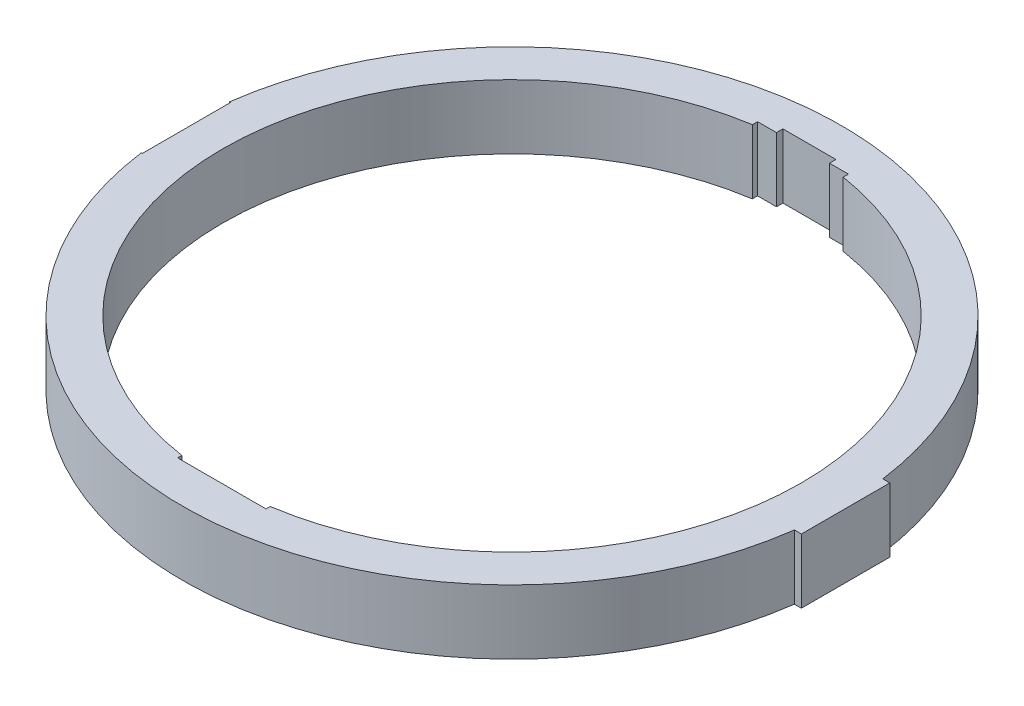
ISO-10303-21;
HEADER;
FILE_DESCRIPTION(('STEP AP214'),'2;1');
FILE_NAME('part.step','',(''),(''),'','','');
FILE_SCHEMA(('AUTOMOTIVE_DESIGN { 1 0 10303 214 1 1 1 1 }'));
ENDSEC;
DATA;
#1=APPLICATION_CONTEXT('core data for automotive mechanical design processes');
#2=APPLICATION_PROTOCOL_DEFINITION('international standard','automotive_design',2000,#1);
#3=PRODUCT_CONTEXT('',#1,'mechanical');
#4=PRODUCT('Part','Part','',(#3));
#5=PRODUCT_RELATED_PRODUCT_CATEGORY('part','',(#4));
#6=PRODUCT_DEFINITION_FORMATION('','',#4);
#7=PRODUCT_DEFINITION_CONTEXT('part definition',#1,'design');
#8=PRODUCT_DEFINITION('design','',#6,#7);
#9=PRODUCT_DEFINITION_SHAPE('','',#8);
#10=(LENGTH_UNIT() NAMED_UNIT(*) SI_UNIT(.MILLI.,.METRE.));
#11=(NAMED_UNIT(*) PLANE_ANGLE_UNIT() SI_UNIT($,.RADIAN.));
#12=(NAMED_UNIT(*) SI_UNIT($,.STERADIAN.) SOLID_ANGLE_UNIT());
#13=UNCERTAINTY_MEASURE_WITH_UNIT(LENGTH_MEASURE(1.E-05),#10,'distance_accuracy_value','');
#14=(GEOMETRIC_REPRESENTATION_CONTEXT(3) GLOBAL_UNCERTAINTY_ASSIGNED_CONTEXT((#13)) GLOBAL_UNIT_ASSIGNED_CONTEXT((#10,
#11,#12)) REPRESENTATION_CONTEXT('',''));
#15=CARTESIAN_POINT('',(0.,0.,0.));
#16=DIRECTION('',(0.,0.,1.));
#17=DIRECTION('',(1.,0.,0.));
#18=AXIS2_PLACEMENT_3D('',#15,#16,#17);
#19=CARTESIAN_POINT('',(0.,80.0000000000003,1.11022302462516E-13));
#20=DIRECTION('',(0.,-1.00000000000003,0.));
#21=DIRECTION('',(0.,0.,-0.999999999999999));
#22=AXIS2_PLACEMENT_3D('',#19,#20,#21);
#23=CYLINDRICAL_SURFACE('',#22,410.);
#24=CARTESIAN_POINT('',(0.,80.0000000000003,1.11022302462516E-13));
#25=DIRECTION('',(0.,1.00000000000003,0.));
#26=DIRECTION('',(0.,0.,0.999999999999999));
#27=AXIS2_PLACEMENT_3D('',#24,#25,#26);
#28=CIRCLE('',#27,410.);
#29=CARTESIAN_POINT('',(-406.294228361667,79.9999999999993,55.0000000000029));
#30=VERTEX_POINT('',#29);
#31=CARTESIAN_POINT('',(406.29422836167,79.9999999999995,54.9999999999953));
#32=VERTEX_POINT('',#31);
#33=EDGE_CURVE('E325',#30,#32,#28,.T.);
#34=ORIENTED_EDGE('',*,*,#33,.F.);
#35=DIRECTION('',(0.,-1.00000000000003,0.));
#36=VECTOR('',#35,1.);
#37=CARTESIAN_POINT('',(-406.294228361667,79.9999999999993,55.0000000000029));
#38=LINE('',#37,#36);
#39=CARTESIAN_POINT('',(-406.294228361671,-3.38618022510673E-12,55.0000000000067));
#40=VERTEX_POINT('',#39);
#41=EDGE_CURVE('E11',#30,#40,#38,.T.);
#42=ORIENTED_EDGE('',*,*,#41,.T.);
#43=CARTESIAN_POINT('',(0.,0.,0.));
#44=DIRECTION('',(0.,1.00000000000003,0.));
#45=DIRECTION('',(0.,0.,0.999999999999999));
#46=AXIS2_PLACEMENT_3D('',#43,#44,#45);
#47=CIRCLE('',#46,410.);
#48=CARTESIAN_POINT('',(406.294228361671,-2.44249065417534E-12,54.9999999999946));
#49=VERTEX_POINT('',#48);
#50=EDGE_CURVE('E316',#40,#49,#47,.T.);
#51=ORIENTED_EDGE('',*,*,#50,.T.);
#52=DIRECTION('',(0.,-1.00000000000003,0.));
#53=VECTOR('',#52,1.);
#54=CARTESIAN_POINT('',(406.29422836167,79.9999999999995,54.9999999999953));
#55=LINE('',#54,#53);
#56=EDGE_CURVE('E224',#32,#49,#55,.T.);
#57=ORIENTED_EDGE('',*,*,#56,.F.);
#58=EDGE_LOOP('',(#34,#42,#51,#57));
#59=FACE_BOUND('',#58,.T.);
#60=ADVANCED_FACE('F36',(#59),#23,.T.);
#61=CARTESIAN_POINT('',(0.,80.0000000000003,1.11022302462516E-13));
#62=DIRECTION('',(0.,-1.00000000000003,0.));
#63=DIRECTION('',(0.,0.,-0.999999999999999));
#64=AXIS2_PLACEMENT_3D('',#61,#62,#63);
#65=CYLINDRICAL_SURFACE('',#64,360.);
#66=DIRECTION('',(0.,-1.00000000000003,0.));
#67=VECTOR('',#66,1.);
#68=CARTESIAN_POINT('',(54.9999999999979,80.0000000000016,355.773804544404));
#69=LINE('',#68,#67);
#70=CARTESIAN_POINT('',(54.9999999999979,80.0000000000016,355.773804544404));
#71=VERTEX_POINT('',#70);
#72=CARTESIAN_POINT('',(55.0000000000004,-3.77475828372553E-12,355.773804544403));
#73=VERTEX_POINT('',#72);
#74=EDGE_CURVE('E334',#71,#73,#69,.T.);
#75=ORIENTED_EDGE('',*,*,#74,.F.);
#76=CARTESIAN_POINT('',(0.,80.0000000000003,1.11022302462516E-13));
#77=DIRECTION('',(0.,1.00000000000003,0.));
#78=DIRECTION('',(0.,0.,0.999999999999999));
#79=AXIS2_PLACEMENT_3D('',#76,#77,#78);
#80=CIRCLE('',#79,360.);
#81=CARTESIAN_POINT('',(56.5000000000064,79.9999999999992,-355.538675814605));
#82=VERTEX_POINT('',#81);
#83=EDGE_CURVE('E317',#71,#82,#80,.T.);
#84=ORIENTED_EDGE('',*,*,#83,.T.);
#85=DIRECTION('',(0.,-1.00000000000003,0.));
#86=VECTOR('',#85,1.);
#87=CARTESIAN_POINT('',(56.5000000000064,79.9999999999992,-355.538675814605));
#88=LINE('',#87,#86);
#89=CARTESIAN_POINT('',(56.500000000008,-1.66533453693773E-12,-355.538675814604));
#90=VERTEX_POINT('',#89);
#91=EDGE_CURVE('E329',#90,#82,#88,.F.);
#92=ORIENTED_EDGE('',*,*,#91,.F.);
#93=CARTESIAN_POINT('',(0.,0.,0.));
#94=DIRECTION('',(0.,1.00000000000003,0.));
#95=DIRECTION('',(0.,0.,0.999999999999999));
#96=AXIS2_PLACEMENT_3D('',#93,#94,#95);
#97=CIRCLE('',#96,360.);
#98=EDGE_CURVE('E312',#73,#90,#97,.T.);
#99=ORIENTED_EDGE('',*,*,#98,.F.);
#100=EDGE_LOOP('',(#75,#84,#92,#99));
#101=FACE_BOUND('',#100,.T.);
#102=ADVANCED_FACE('F367',(#101),#65,.F.);
#103=CARTESIAN_POINT('',(0.,80.0000000000003,1.11022302462516E-13));
#104=DIRECTION('',(0.,1.00000000000003,0.));
#105=DIRECTION('',(0.,0.,0.999999999999999));
#106=AXIS2_PLACEMENT_3D('',#103,#104,#105);
#107=PLANE('',#106);
#108=DIRECTION('',(1.00000000000002,0.,0.));
#109=VECTOR('',#108,1.);
#110=CARTESIAN_POINT('',(-446.700000000004,79.9999999999967,55.0000000000052));
#111=LINE('',#110,#109);
#112=CARTESIAN_POINT('',(-405.,80.0000000000001,55.0000000000005));
#113=VERTEX_POINT('',#112);
#114=EDGE_CURVE('E206',#30,#113,#111,.T.);
#115=ORIENTED_EDGE('',*,*,#114,.F.);
#116=ORIENTED_EDGE('',*,*,#33,.T.);
#117=DIRECTION('',(1.00000000000001,0.,0.));
#118=VECTOR('',#117,1.);
#119=CARTESIAN_POINT('',(-410.001000000003,79.9999999999988,55.0000000000066));
#120=LINE('',#119,#118);
#121=CARTESIAN_POINT('',(415.000000000006,80.0000000000008,54.9999999999951));
#122=VERTEX_POINT('',#121);
#123=EDGE_CURVE('E212',#32,#122,#120,.T.);
#124=ORIENTED_EDGE('',*,*,#123,.T.);
#125=DIRECTION('',(0.,0.,1.));
#126=VECTOR('',#125,1.);
#127=CARTESIAN_POINT('',(415.000000000008,80.0000000000008,-55.0000000000054));
#128=LINE('',#127,#126);
#129=CARTESIAN_POINT('',(415.000000000008,80.0000000000008,-55.0000000000054));
#130=VERTEX_POINT('',#129);
#131=EDGE_CURVE('E216',#130,#122,#128,.T.);
#132=ORIENTED_EDGE('',*,*,#131,.F.);
#133=DIRECTION('',(1.00000000000001,0.,0.));
#134=VECTOR('',#133,1.);
#135=CARTESIAN_POINT('',(-410.001000000001,79.9999999999981,-54.9999999999979));
#136=LINE('',#135,#134);
#137=CARTESIAN_POINT('',(406.294228361671,79.9999999999992,-55.0000000000054));
#138=VERTEX_POINT('',#137);
#139=EDGE_CURVE('E223',#138,#130,#136,.T.);
#140=ORIENTED_EDGE('',*,*,#139,.F.);
#141=CARTESIAN_POINT('',(-406.294228361668,79.9999999999979,-54.9999999999952));
#142=VERTEX_POINT('',#141);
#143=EDGE_CURVE('E321',#138,#142,#28,.T.);
#144=ORIENTED_EDGE('',*,*,#143,.T.);
#145=DIRECTION('',(1.00000000000002,0.,0.));
#146=VECTOR('',#145,1.);
#147=CARTESIAN_POINT('',(-446.700000000002,79.9999999999973,-54.9999999999969));
#148=LINE('',#147,#146);
#149=CARTESIAN_POINT('',(-405.,80.,-54.9999999999994));
#150=VERTEX_POINT('',#149);
#151=EDGE_CURVE('E51',#142,#150,#148,.T.);
#152=ORIENTED_EDGE('',*,*,#151,.T.);
#153=DIRECTION('',(0.,0.,1.));
#154=VECTOR('',#153,1.);
#155=CARTESIAN_POINT('',(-405.,80.,-54.9999999999994));
#156=LINE('',#155,#154);
#157=EDGE_CURVE('E188',#150,#113,#156,.T.);
#158=ORIENTED_EDGE('',*,*,#157,.T.);
#159=EDGE_LOOP('',(#115,#116,#124,#132,#140,#144,#152,#158));
#160=FACE_BOUND('',#159,.T.);
#161=DIRECTION('',(0.,0.,0.999999999999999));
#162=VECTOR('',#161,1.);
#163=CARTESIAN_POINT('',(54.9999999999986,79.999999999999,330.999999999998));
#164=LINE('',#163,#162);
#165=CARTESIAN_POINT('',(54.9999999999975,80.0000000000013,360.999999999998));
#166=VERTEX_POINT('',#165);
#167=EDGE_CURVE('E249',#71,#166,#164,.T.);
#168=ORIENTED_EDGE('',*,*,#167,.T.);
#169=DIRECTION('',(-1.00000000000002,0.,0.));
#170=VECTOR('',#169,1.);
#171=CARTESIAN_POINT('',(54.9999999999975,80.0000000000013,360.999999999998));
#172=LINE('',#171,#170);
#173=CARTESIAN_POINT('',(-55.0000000000017,80.0000000000008,360.999999999999));
#174=VERTEX_POINT('',#173);
#175=EDGE_CURVE('E241',#166,#174,#172,.T.);
#176=ORIENTED_EDGE('',*,*,#175,.T.);
#177=DIRECTION('',(0.,0.,0.999999999999999));
#178=VECTOR('',#177,1.);
#179=CARTESIAN_POINT('',(-55.0000000000008,80.0000000000006,330.999999999999));
#180=LINE('',#179,#178);
#181=CARTESIAN_POINT('',(-55.0000000000022,80.0000000000007,355.773804544402));
#182=VERTEX_POINT('',#181);
#183=EDGE_CURVE('E256',#182,#174,#180,.T.);
#184=ORIENTED_EDGE('',*,*,#183,.F.);
#185=CARTESIAN_POINT('',(-56.4999999999936,79.9999999999997,-355.538675814602));
#186=VERTEX_POINT('',#185);
#187=EDGE_CURVE('E313',#186,#182,#80,.T.);
#188=ORIENTED_EDGE('',*,*,#187,.F.);
#189=DIRECTION('',(0.,0.,0.999999999999999));
#190=VECTOR('',#189,1.);
#191=CARTESIAN_POINT('',(-56.4999999999994,80.0000000000002,-2.22044604925031E-13));
#192=LINE('',#191,#190);
#193=CARTESIAN_POINT('',(-56.4999999999993,80.0000000000002,-362.));
#194=VERTEX_POINT('',#193);
#195=EDGE_CURVE('E284',#194,#186,#192,.T.);
#196=ORIENTED_EDGE('',*,*,#195,.F.);
#197=DIRECTION('',(-1.00000000000002,0.,0.));
#198=VECTOR('',#197,1.);
#199=CARTESIAN_POINT('',(3.5527136788005E-12,80.000000000001,-362.));
#200=LINE('',#199,#198);
#201=CARTESIAN_POINT('',(-32.9999999999956,79.9999999999991,-362.000000000003));
#202=VERTEX_POINT('',#201);
#203=EDGE_CURVE('E310',#202,#194,#200,.T.);
#204=ORIENTED_EDGE('',*,*,#203,.F.);
#205=DIRECTION('',(0.,0.,0.999999999999999));
#206=VECTOR('',#205,1.);
#207=CARTESIAN_POINT('',(-32.9999999999999,79.9999999999998,0.));
#208=LINE('',#207,#206);
#209=CARTESIAN_POINT('',(-33.0000000000001,79.9999999999993,-369.999999999998));
#210=VERTEX_POINT('',#209);
#211=EDGE_CURVE('E308',#210,#202,#208,.T.);
#212=ORIENTED_EDGE('',*,*,#211,.F.);
#213=DIRECTION('',(-1.00000000000002,0.,0.));
#214=VECTOR('',#213,1.);
#215=CARTESIAN_POINT('',(4.21884749357559E-12,79.9999999999982,-370.000000000003));
#216=LINE('',#215,#214);
#217=CARTESIAN_POINT('',(33.0000000000071,79.9999999999996,-370.000000000003));
#218=VERTEX_POINT('',#217);
#219=EDGE_CURVE('E306',#218,#210,#216,.T.);
#220=ORIENTED_EDGE('',*,*,#219,.F.);
#221=DIRECTION('',(0.,0.,-0.999999999999999));
#222=VECTOR('',#221,1.);
#223=CARTESIAN_POINT('',(33.0000000000006,79.9999999999995,-1.11022302462516E-13));
#224=LINE('',#223,#222);
#225=CARTESIAN_POINT('',(33.0000000000056,80.0000000000003,-362.000000000003));
#226=VERTEX_POINT('',#225);
#227=EDGE_CURVE('E304',#226,#218,#224,.T.);
#228=ORIENTED_EDGE('',*,*,#227,.F.);
#229=DIRECTION('',(-1.00000000000002,0.,0.));
#230=VECTOR('',#229,1.);
#231=CARTESIAN_POINT('',(3.5527136788005E-12,80.000000000001,-362.));
#232=LINE('',#231,#230);
#233=CARTESIAN_POINT('',(56.5000000000068,80.0000000000018,-362.000000000003));
#234=VERTEX_POINT('',#233);
#235=EDGE_CURVE('E302',#234,#226,#232,.T.);
#236=ORIENTED_EDGE('',*,*,#235,.F.);
#237=DIRECTION('',(0.,0.,-0.999999999999999));
#238=VECTOR('',#237,1.);
#239=CARTESIAN_POINT('',(56.5000000000004,80.0000000000015,0.));
#240=LINE('',#239,#238);
#241=EDGE_CURVE('E300',#82,#234,#240,.T.);
#242=ORIENTED_EDGE('',*,*,#241,.F.);
#243=ORIENTED_EDGE('',*,*,#83,.F.);
#244=EDGE_LOOP('',(#168,#176,#184,#188,#196,#204,#212,#220,#228,#236,#242,#243));
#245=FACE_BOUND('',#244,.T.);
#246=ADVANCED_FACE('F340',(#160,#245),#107,.T.);
#247=CARTESIAN_POINT('',(0.,0.,0.));
#248=DIRECTION('',(0.,1.00000000000003,0.));
#249=DIRECTION('',(0.,0.,0.999999999999999));
#250=AXIS2_PLACEMENT_3D('',#247,#248,#249);
#251=PLANE('',#250);
#252=ORIENTED_EDGE('',*,*,#50,.F.);
#253=DIRECTION('',(1.00000000000002,0.,0.));
#254=VECTOR('',#253,1.);
#255=CARTESIAN_POINT('',(-446.700000000004,-3.10862446895044E-12,55.0000000000027));
#256=LINE('',#255,#254);
#257=CARTESIAN_POINT('',(-405.,-1.77635683940025E-12,55.0000000000007));
#258=VERTEX_POINT('',#257);
#259=EDGE_CURVE('E194',#40,#258,#256,.T.);
#260=ORIENTED_EDGE('',*,*,#259,.T.);
#261=DIRECTION('',(0.,0.,-1.));
#262=VECTOR('',#261,1.);
#263=CARTESIAN_POINT('',(-405.,-1.77635683940025E-12,55.0000000000007));
#264=LINE('',#263,#262);
#265=CARTESIAN_POINT('',(-405.000000000006,-9.43689570931383E-13,-54.9999999999937));
#266=VERTEX_POINT('',#265);
#267=EDGE_CURVE('E185',#258,#266,#264,.T.);
#268=ORIENTED_EDGE('',*,*,#267,.T.);
#269=DIRECTION('',(1.00000000000002,0.,0.));
#270=VECTOR('',#269,1.);
#271=CARTESIAN_POINT('',(-446.700000000004,-3.33066907387547E-12,-54.9999999999948));
#272=LINE('',#271,#270);
#273=CARTESIAN_POINT('',(-406.294228361666,-4.82947015711943E-12,-54.9999999999939));
#274=VERTEX_POINT('',#273);
#275=EDGE_CURVE('E172',#274,#266,#272,.T.);
#276=ORIENTED_EDGE('',*,*,#275,.F.);
#277=CARTESIAN_POINT('',(406.294228361671,-1.55431223447522E-12,-55.0000000000052));
#278=VERTEX_POINT('',#277);
#279=EDGE_CURVE('E326',#278,#274,#47,.T.);
#280=ORIENTED_EDGE('',*,*,#279,.F.);
#281=DIRECTION('',(1.00000000000001,0.,0.));
#282=VECTOR('',#281,1.);
#283=CARTESIAN_POINT('',(-410.001000000005,-3.60822483003176E-12,-54.9999999999949));
#284=LINE('',#283,#282);
#285=CARTESIAN_POINT('',(415.000000000008,-2.77555756156289E-13,-55.000000000005));
#286=VERTEX_POINT('',#285);
#287=EDGE_CURVE('E59',#278,#286,#284,.T.);
#288=ORIENTED_EDGE('',*,*,#287,.T.);
#289=DIRECTION('',(0.,0.,-1.));
#290=VECTOR('',#289,1.);
#291=CARTESIAN_POINT('',(415.000000000006,-8.32667268468867E-13,54.9999999999941));
#292=LINE('',#291,#290);
#293=CARTESIAN_POINT('',(415.000000000006,-8.32667268468867E-13,54.9999999999941));
#294=VERTEX_POINT('',#293);
#295=EDGE_CURVE('E209',#294,#286,#292,.T.);
#296=ORIENTED_EDGE('',*,*,#295,.F.);
#297=DIRECTION('',(1.00000000000001,0.,0.));
#298=VECTOR('',#297,1.);
#299=CARTESIAN_POINT('',(-410.001000000005,-3.10862446895044E-12,55.0000000000062));
#300=LINE('',#299,#298);
#301=EDGE_CURVE('E227',#49,#294,#300,.T.);
#302=ORIENTED_EDGE('',*,*,#301,.F.);
#303=EDGE_LOOP('',(#252,#260,#268,#276,#280,#288,#296,#302));
#304=FACE_BOUND('',#303,.T.);
#305=DIRECTION('',(1.00000000000002,0.,0.));
#306=VECTOR('',#305,1.);
#307=CARTESIAN_POINT('',(-55.0000000000026,-5.38458166943201E-12,361.));
#308=LINE('',#307,#306);
#309=CARTESIAN_POINT('',(-55.0000000000026,-5.38458166943201E-12,361.));
#310=VERTEX_POINT('',#309);
#311=CARTESIAN_POINT('',(54.9999999999989,1.11022302462516E-13,360.999999999999));
#312=VERTEX_POINT('',#311);
#313=EDGE_CURVE('E246',#310,#312,#308,.T.);
#314=ORIENTED_EDGE('',*,*,#313,.T.);
#315=DIRECTION('',(0.,0.,0.999999999999999));
#316=VECTOR('',#315,1.);
#317=CARTESIAN_POINT('',(55.0000000000004,-4.77395900588817E-12,330.999999999999));
#318=LINE('',#317,#316);
#319=EDGE_CURVE('E250',#73,#312,#318,.T.);
#320=ORIENTED_EDGE('',*,*,#319,.F.);
#321=ORIENTED_EDGE('',*,*,#98,.T.);
#322=DIRECTION('',(0.,0.,-0.999999999999999));
#323=VECTOR('',#322,1.);
#324=CARTESIAN_POINT('',(56.5000000000081,-2.60902410786912E-12,-287.026437490003));
#325=LINE('',#324,#323);
#326=CARTESIAN_POINT('',(56.5000000000089,-1.55431223447522E-12,-362.000000000002));
#327=VERTEX_POINT('',#326);
#328=EDGE_CURVE('E252',#90,#327,#325,.T.);
#329=ORIENTED_EDGE('',*,*,#328,.T.);
#330=DIRECTION('',(-1.00000000000002,0.,0.));
#331=VECTOR('',#330,1.);
#332=CARTESIAN_POINT('',(56.5000000000089,-1.55431223447522E-12,-362.000000000002));
#333=LINE('',#332,#331);
#334=CARTESIAN_POINT('',(33.0000000000059,-3.1641356201817E-12,-362.000000000002));
#335=VERTEX_POINT('',#334);
#336=EDGE_CURVE('E262',#327,#335,#333,.T.);
#337=ORIENTED_EDGE('',*,*,#336,.T.);
#338=DIRECTION('',(0.,0.,-0.999999999999999));
#339=VECTOR('',#338,1.);
#340=CARTESIAN_POINT('',(33.0000000000059,-3.1641356201817E-12,-362.000000000002));
#341=LINE('',#340,#339);
#342=CARTESIAN_POINT('',(33.0000000000054,-3.5527136788005E-12,-370.000000000002));
#343=VERTEX_POINT('',#342);
#344=EDGE_CURVE('E265',#335,#343,#341,.T.);
#345=ORIENTED_EDGE('',*,*,#344,.T.);
#346=DIRECTION('',(-1.00000000000002,0.,0.));
#347=VECTOR('',#346,1.);
#348=CARTESIAN_POINT('',(33.0000000000054,-3.5527136788005E-12,-370.000000000002));
#349=LINE('',#348,#347);
#350=CARTESIAN_POINT('',(-32.9999999999934,-3.27515792264421E-12,-370.000000000003));
#351=VERTEX_POINT('',#350);
#352=EDGE_CURVE('E268',#343,#351,#349,.T.);
#353=ORIENTED_EDGE('',*,*,#352,.T.);
#354=DIRECTION('',(0.,0.,0.999999999999999));
#355=VECTOR('',#354,1.);
#356=CARTESIAN_POINT('',(-32.9999999999934,-3.27515792264421E-12,-370.000000000003));
#357=LINE('',#356,#355);
#358=CARTESIAN_POINT('',(-32.9999999999948,-2.88657986402541E-12,-362.000000000002));
#359=VERTEX_POINT('',#358);
#360=EDGE_CURVE('E271',#351,#359,#357,.T.);
#361=ORIENTED_EDGE('',*,*,#360,.T.);
#362=DIRECTION('',(-1.00000000000002,0.,0.));
#363=VECTOR('',#362,1.);
#364=CARTESIAN_POINT('',(-32.9999999999948,-2.88657986402541E-12,-362.000000000002));
#365=LINE('',#364,#363);
#366=CARTESIAN_POINT('',(-56.4999999999956,-1.11022302462516E-12,-362.000000000001));
#367=VERTEX_POINT('',#366);
#368=EDGE_CURVE('E274',#359,#367,#365,.T.);
#369=ORIENTED_EDGE('',*,*,#368,.T.);
#370=DIRECTION('',(0.,0.,0.999999999999999));
#371=VECTOR('',#370,1.);
#372=CARTESIAN_POINT('',(-56.4999999999956,-1.11022302462516E-12,-362.000000000001));
#373=LINE('',#372,#371);
#374=CARTESIAN_POINT('',(-56.4999999999949,-3.10862446895044E-12,-355.538675814603));
#375=VERTEX_POINT('',#374);
#376=EDGE_CURVE('E277',#367,#375,#373,.T.);
#377=ORIENTED_EDGE('',*,*,#376,.T.);
#378=CARTESIAN_POINT('',(-55.0000000000033,-2.27595720048157E-12,355.773804544405));
#379=VERTEX_POINT('',#378);
#380=EDGE_CURVE('E318',#375,#379,#97,.T.);
#381=ORIENTED_EDGE('',*,*,#380,.T.);
#382=DIRECTION('',(0.,0.,0.999999999999999));
#383=VECTOR('',#382,1.);
#384=CARTESIAN_POINT('',(-55.0000000000015,-3.49720252756924E-12,331.000000000001));
#385=LINE('',#384,#383);
#386=EDGE_CURVE('E253',#379,#310,#385,.T.);
#387=ORIENTED_EDGE('',*,*,#386,.T.);
#388=EDGE_LOOP('',(#314,#320,#321,#329,#337,#345,#353,#361,#369,#377,#381,#387));
#389=FACE_BOUND('',#388,.T.);
#390=ADVANCED_FACE('F192',(#304,#389),#251,.F.);
#391=ORIENTED_EDGE('',*,*,#279,.T.);
#392=DIRECTION('',(0.,-1.00000000000003,0.));
#393=VECTOR('',#392,1.);
#394=CARTESIAN_POINT('',(-406.294228361668,79.9999999999979,-54.9999999999952));
#395=LINE('',#394,#393);
#396=EDGE_CURVE('E44',#274,#142,#395,.F.);
#397=ORIENTED_EDGE('',*,*,#396,.T.);
#398=ORIENTED_EDGE('',*,*,#143,.F.);
#399=DIRECTION('',(0.,-1.00000000000003,0.));
#400=VECTOR('',#399,1.);
#401=CARTESIAN_POINT('',(406.294228361671,79.9999999999992,-55.0000000000054));
#402=LINE('',#401,#400);
#403=EDGE_CURVE('E221',#278,#138,#402,.F.);
#404=ORIENTED_EDGE('',*,*,#403,.F.);
#405=EDGE_LOOP('',(#391,#397,#398,#404));
#406=FACE_BOUND('',#405,.T.);
#407=ADVANCED_FACE('F38',(#406),#23,.T.);
#408=DIRECTION('',(0.,-1.00000000000003,0.));
#409=VECTOR('',#408,1.);
#410=CARTESIAN_POINT('',(-55.0000000000022,80.0000000000007,355.773804544402));
#411=LINE('',#410,#409);
#412=EDGE_CURVE('E332',#379,#182,#411,.F.);
#413=ORIENTED_EDGE('',*,*,#412,.F.);
#414=ORIENTED_EDGE('',*,*,#380,.F.);
#415=DIRECTION('',(0.,-1.00000000000003,0.));
#416=VECTOR('',#415,1.);
#417=CARTESIAN_POINT('',(-56.4999999999936,79.9999999999997,-355.538675814602));
#418=LINE('',#417,#416);
#419=EDGE_CURVE('E324',#186,#375,#418,.T.);
#420=ORIENTED_EDGE('',*,*,#419,.F.);
#421=ORIENTED_EDGE('',*,*,#187,.T.);
#422=EDGE_LOOP('',(#413,#414,#420,#421));
#423=FACE_BOUND('',#422,.T.);
#424=ADVANCED_FACE('F373',(#423),#65,.F.);
#425=CARTESIAN_POINT('',(56.5000000000081,-2.60902410786912E-12,-287.026437490003));
#426=DIRECTION('',(1.00000000000002,0.,0.));
#427=DIRECTION('',(0.,0.,-0.999999999999999));
#428=AXIS2_PLACEMENT_3D('',#425,#426,#427);
#429=PLANE('',#428);
#430=ORIENTED_EDGE('',*,*,#241,.T.);
#431=DIRECTION('',(0.,1.00000000000003,0.));
#432=VECTOR('',#431,1.);
#433=CARTESIAN_POINT('',(56.5000000000089,-1.55431223447522E-12,-362.000000000002));
#434=LINE('',#433,#432);
#435=EDGE_CURVE('E280',#327,#234,#434,.T.);
#436=ORIENTED_EDGE('',*,*,#435,.F.);
#437=ORIENTED_EDGE('',*,*,#328,.F.);
#438=ORIENTED_EDGE('',*,*,#91,.T.);
#439=EDGE_LOOP('',(#430,#436,#437,#438));
#440=FACE_BOUND('',#439,.T.);
#441=ADVANCED_FACE('F379',(#440),#429,.F.);
#442=CARTESIAN_POINT('',(-56.4999999999956,-1.11022302462516E-12,-362.000000000001));
#443=DIRECTION('',(-1.00000000000001,0.,0.));
#444=DIRECTION('',(0.,0.,0.999999999999999));
#445=AXIS2_PLACEMENT_3D('',#442,#443,#444);
#446=PLANE('',#445);
#447=ORIENTED_EDGE('',*,*,#195,.T.);
#448=ORIENTED_EDGE('',*,*,#419,.T.);
#449=ORIENTED_EDGE('',*,*,#376,.F.);
#450=DIRECTION('',(0.,1.00000000000003,0.));
#451=VECTOR('',#450,1.);
#452=CARTESIAN_POINT('',(-56.4999999999956,-1.11022302462516E-12,-362.000000000001));
#453=LINE('',#452,#451);
#454=EDGE_CURVE('E281',#367,#194,#453,.T.);
#455=ORIENTED_EDGE('',*,*,#454,.T.);
#456=EDGE_LOOP('',(#447,#448,#449,#455));
#457=FACE_BOUND('',#456,.T.);
#458=ADVANCED_FACE('F388',(#457),#446,.F.);
#459=CARTESIAN_POINT('',(-32.9999999999948,-2.88657986402541E-12,-362.000000000002));
#460=DIRECTION('',(0.,0.,-0.999999999999999));
#461=DIRECTION('',(-1.00000000000002,0.,0.));
#462=AXIS2_PLACEMENT_3D('',#459,#460,#461);
#463=PLANE('',#462);
#464=ORIENTED_EDGE('',*,*,#203,.T.);
#465=ORIENTED_EDGE('',*,*,#454,.F.);
#466=ORIENTED_EDGE('',*,*,#368,.F.);
#467=DIRECTION('',(0.,1.00000000000003,0.));
#468=VECTOR('',#467,1.);
#469=CARTESIAN_POINT('',(-32.9999999999948,-2.88657986402541E-12,-362.000000000002));
#470=LINE('',#469,#468);
#471=EDGE_CURVE('E285',#359,#202,#470,.T.);
#472=ORIENTED_EDGE('',*,*,#471,.T.);
#473=EDGE_LOOP('',(#464,#465,#466,#472));
#474=FACE_BOUND('',#473,.T.);
#475=ADVANCED_FACE('F406',(#474),#463,.F.);
#476=CARTESIAN_POINT('',(-32.9999999999934,-3.27515792264421E-12,-370.000000000003));
#477=DIRECTION('',(-1.00000000000002,0.,0.));
#478=DIRECTION('',(0.,0.,0.999999999999999));
#479=AXIS2_PLACEMENT_3D('',#476,#477,#478);
#480=PLANE('',#479);
#481=ORIENTED_EDGE('',*,*,#211,.T.);
#482=ORIENTED_EDGE('',*,*,#471,.F.);
#483=ORIENTED_EDGE('',*,*,#360,.F.);
#484=DIRECTION('',(0.,1.00000000000003,0.));
#485=VECTOR('',#484,1.);
#486=CARTESIAN_POINT('',(-32.9999999999934,-3.27515792264421E-12,-370.000000000003));
#487=LINE('',#486,#485);
#488=EDGE_CURVE('E288',#351,#210,#487,.T.);
#489=ORIENTED_EDGE('',*,*,#488,.T.);
#490=EDGE_LOOP('',(#481,#482,#483,#489));
#491=FACE_BOUND('',#490,.T.);
#492=ADVANCED_FACE('F402',(#491),#480,.F.);
#493=CARTESIAN_POINT('',(33.0000000000054,-3.5527136788005E-12,-370.000000000002));
#494=DIRECTION('',(0.,0.,-0.999999999999999));
#495=DIRECTION('',(-1.00000000000002,0.,0.));
#496=AXIS2_PLACEMENT_3D('',#493,#494,#495);
#497=PLANE('',#496);
#498=ORIENTED_EDGE('',*,*,#219,.T.);
#499=ORIENTED_EDGE('',*,*,#488,.F.);
#500=ORIENTED_EDGE('',*,*,#352,.F.);
#501=DIRECTION('',(0.,1.00000000000003,0.));
#502=VECTOR('',#501,1.);
#503=CARTESIAN_POINT('',(33.0000000000054,-3.5527136788005E-12,-370.000000000002));
#504=LINE('',#503,#502);
#505=EDGE_CURVE('E291',#343,#218,#504,.T.);
#506=ORIENTED_EDGE('',*,*,#505,.T.);
#507=EDGE_LOOP('',(#498,#499,#500,#506));
#508=FACE_BOUND('',#507,.T.);
#509=ADVANCED_FACE('F398',(#508),#497,.F.);
#510=CARTESIAN_POINT('',(33.0000000000059,-3.1641356201817E-12,-362.000000000002));
#511=DIRECTION('',(1.00000000000002,0.,0.));
#512=DIRECTION('',(0.,0.,-0.999999999999999));
#513=AXIS2_PLACEMENT_3D('',#510,#511,#512);
#514=PLANE('',#513);
#515=ORIENTED_EDGE('',*,*,#227,.T.);
#516=ORIENTED_EDGE('',*,*,#505,.F.);
#517=ORIENTED_EDGE('',*,*,#344,.F.);
#518=DIRECTION('',(0.,1.00000000000003,0.));
#519=VECTOR('',#518,1.);
#520=CARTESIAN_POINT('',(33.0000000000059,-3.1641356201817E-12,-362.000000000002));
#521=LINE('',#520,#519);
#522=EDGE_CURVE('E294',#335,#226,#521,.T.);
#523=ORIENTED_EDGE('',*,*,#522,.T.);
#524=EDGE_LOOP('',(#515,#516,#517,#523));
#525=FACE_BOUND('',#524,.T.);
#526=ADVANCED_FACE('F394',(#525),#514,.F.);
#527=CARTESIAN_POINT('',(56.5000000000089,-1.55431223447522E-12,-362.000000000002));
#528=DIRECTION('',(0.,0.,-0.999999999999999));
#529=DIRECTION('',(-1.00000000000002,0.,0.));
#530=AXIS2_PLACEMENT_3D('',#527,#528,#529);
#531=PLANE('',#530);
#532=ORIENTED_EDGE('',*,*,#235,.T.);
#533=ORIENTED_EDGE('',*,*,#522,.F.);
#534=ORIENTED_EDGE('',*,*,#336,.F.);
#535=ORIENTED_EDGE('',*,*,#435,.T.);
#536=EDGE_LOOP('',(#532,#533,#534,#535));
#537=FACE_BOUND('',#536,.T.);
#538=ADVANCED_FACE('F390',(#537),#531,.F.);
#539=CARTESIAN_POINT('',(55.0000000000004,-4.77395900588817E-12,330.999999999999));
#540=DIRECTION('',(1.00000000000002,0.,0.));
#541=DIRECTION('',(0.,1.00000000000003,0.));
#542=AXIS2_PLACEMENT_3D('',#539,#540,#541);
#543=PLANE('',#542);
#544=ORIENTED_EDGE('',*,*,#74,.T.);
#545=ORIENTED_EDGE('',*,*,#319,.T.);
#546=DIRECTION('',(0.,1.00000000000003,0.));
#547=VECTOR('',#546,1.);
#548=CARTESIAN_POINT('',(54.9999999999989,1.11022302462516E-13,360.999999999999));
#549=LINE('',#548,#547);
#550=EDGE_CURVE('E236',#312,#166,#549,.T.);
#551=ORIENTED_EDGE('',*,*,#550,.T.);
#552=ORIENTED_EDGE('',*,*,#167,.F.);
#553=EDGE_LOOP('',(#544,#545,#551,#552));
#554=FACE_BOUND('',#553,.T.);
#555=ADVANCED_FACE('F393',(#554),#543,.F.);
#556=CARTESIAN_POINT('',(-55.0000000000008,80.0000000000006,330.999999999999));
#557=DIRECTION('',(-1.00000000000002,0.,0.));
#558=DIRECTION('',(0.,-1.00000000000003,0.));
#559=AXIS2_PLACEMENT_3D('',#556,#557,#558);
#560=PLANE('',#559);
#561=ORIENTED_EDGE('',*,*,#412,.T.);
#562=ORIENTED_EDGE('',*,*,#183,.T.);
#563=DIRECTION('',(0.,-1.00000000000003,0.));
#564=VECTOR('',#563,1.);
#565=CARTESIAN_POINT('',(-55.0000000000017,80.0000000000008,360.999999999999));
#566=LINE('',#565,#564);
#567=EDGE_CURVE('E244',#174,#310,#566,.T.);
#568=ORIENTED_EDGE('',*,*,#567,.T.);
#569=ORIENTED_EDGE('',*,*,#386,.F.);
#570=EDGE_LOOP('',(#561,#562,#568,#569));
#571=FACE_BOUND('',#570,.T.);
#572=ADVANCED_FACE('F416',(#571),#560,.F.);
#573=CARTESIAN_POINT('',(-1.33226762955019E-12,-1.55431223447522E-12,361.));
#574=DIRECTION('',(0.,0.,0.999999999999999));
#575=DIRECTION('',(1.00000000000002,0.,0.));
#576=AXIS2_PLACEMENT_3D('',#573,#574,#575);
#577=PLANE('',#576);
#578=CARTESIAN_POINT('',(-3.33066907387547E-13,40.0000000000013,361.));
#579=DIRECTION('',(0.,0.,-0.999999999999999));
#580=DIRECTION('',(-1.00000000000002,0.,0.));
#581=AXIS2_PLACEMENT_3D('',#578,#579,#580);
#582=CIRCLE('',#581,31.);
#583=CARTESIAN_POINT('',(-30.9999999999995,40.0000000000015,361.));
#584=VERTEX_POINT('',#583);
#585=EDGE_CURVE('E229',#584,#584,#582,.T.);
#586=ORIENTED_EDGE('',*,*,#585,.F.);
#587=EDGE_LOOP('',(#586));
#588=FACE_BOUND('',#587,.T.);
#589=ORIENTED_EDGE('',*,*,#550,.F.);
#590=ORIENTED_EDGE('',*,*,#313,.F.);
#591=ORIENTED_EDGE('',*,*,#567,.F.);
#592=ORIENTED_EDGE('',*,*,#175,.F.);
#593=EDGE_LOOP('',(#589,#590,#591,#592));
#594=FACE_BOUND('',#593,.T.);
#595=ADVANCED_FACE('F420',(#588,#594),#577,.F.);
#596=CARTESIAN_POINT('',(8.88178419700125E-13,40.0000000000015,372.999999999999));
#597=DIRECTION('',(0.,0.,-0.999999999999999));
#598=DIRECTION('',(-1.00000000000002,0.,0.));
#599=AXIS2_PLACEMENT_3D('',#596,#597,#598);
#600=CYLINDRICAL_SURFACE('',#599,31.);
#601=CARTESIAN_POINT('',(8.88178419700125E-13,40.0000000000015,372.999999999999));
#602=DIRECTION('',(0.,0.,-0.999999999999999));
#603=DIRECTION('',(-1.00000000000002,0.,0.));
#604=AXIS2_PLACEMENT_3D('',#601,#602,#603);
#605=CIRCLE('',#604,31.);
#606=CARTESIAN_POINT('',(-30.9999999999996,40.0000000000015,372.999999999999));
#607=VERTEX_POINT('',#606);
#608=EDGE_CURVE('E233',#607,#607,#605,.T.);
#609=CARTESIAN_POINT('',(-30.9999999999996,40.0000000000015,372.999999999999));
#610=CARTESIAN_POINT('',(-30.9999999999996,40.0000000000015,372.874999999999));
#611=CARTESIAN_POINT('',(-30.9999999999996,40.0000000000015,372.749999999999));
#612=CARTESIAN_POINT('',(-30.9999999999996,40.0000000000015,372.499999999999));
#613=CARTESIAN_POINT('',(-30.9999999999996,40.0000000000015,372.374999999999));
#614=CARTESIAN_POINT('',(-30.9999999999996,40.0000000000015,372.124999999999));
#615=CARTESIAN_POINT('',(-30.9999999999996,40.0000000000015,371.999999999999));
#616=CARTESIAN_POINT('',(-30.9999999999996,40.0000000000015,371.749999999999));
#617=CARTESIAN_POINT('',(-30.9999999999996,40.0000000000015,371.624999999999));
#618=CARTESIAN_POINT('',(-30.9999999999996,40.0000000000015,371.374999999999));
#619=CARTESIAN_POINT('',(-30.9999999999996,40.0000000000015,371.249999999999));
#620=CARTESIAN_POINT('',(-30.9999999999996,40.0000000000015,370.999999999999));
#621=CARTESIAN_POINT('',(-30.9999999999996,40.0000000000015,370.874999999999));
#622=CARTESIAN_POINT('',(-30.9999999999996,40.0000000000015,370.624999999999));
#623=CARTESIAN_POINT('',(-30.9999999999996,40.0000000000015,370.499999999999));
#624=CARTESIAN_POINT('',(-30.9999999999996,40.0000000000015,370.249999999999));
#625=CARTESIAN_POINT('',(-30.9999999999996,40.0000000000015,370.124999999999));
#626=CARTESIAN_POINT('',(-30.9999999999996,40.0000000000015,369.874999999999));
#627=CARTESIAN_POINT('',(-30.9999999999996,40.0000000000015,369.749999999999));
#628=CARTESIAN_POINT('',(-30.9999999999996,40.0000000000015,369.499999999999));
#629=CARTESIAN_POINT('',(-30.9999999999996,40.0000000000015,369.374999999999));
#630=CARTESIAN_POINT('',(-30.9999999999996,40.0000000000015,369.124999999999));
#631=CARTESIAN_POINT('',(-30.9999999999996,40.0000000000015,368.999999999999));
#632=CARTESIAN_POINT('',(-30.9999999999996,40.0000000000015,368.749999999999));
#633=CARTESIAN_POINT('',(-30.9999999999996,40.0000000000015,368.624999999999));
#634=CARTESIAN_POINT('',(-30.9999999999996,40.0000000000015,368.374999999999));
#635=CARTESIAN_POINT('',(-30.9999999999996,40.0000000000015,368.249999999999));
#636=CARTESIAN_POINT('',(-30.9999999999996,40.0000000000015,367.999999999999));
#637=CARTESIAN_POINT('',(-30.9999999999996,40.0000000000015,367.874999999999));
#638=CARTESIAN_POINT('',(-30.9999999999996,40.0000000000015,367.624999999999));
#639=CARTESIAN_POINT('',(-30.9999999999995,40.0000000000015,367.499999999999));
#640=CARTESIAN_POINT('',(-30.9999999999995,40.0000000000015,367.249999999999));
#641=CARTESIAN_POINT('',(-30.9999999999995,40.0000000000015,367.124999999999));
#642=CARTESIAN_POINT('',(-30.9999999999995,40.0000000000015,366.874999999999));
#643=CARTESIAN_POINT('',(-30.9999999999995,40.0000000000015,366.749999999999));
#644=CARTESIAN_POINT('',(-30.9999999999995,40.0000000000015,366.499999999999));
#645=CARTESIAN_POINT('',(-30.9999999999995,40.0000000000015,366.374999999999));
#646=CARTESIAN_POINT('',(-30.9999999999995,40.0000000000015,366.124999999999));
#647=CARTESIAN_POINT('',(-30.9999999999995,40.0000000000015,365.999999999999));
#648=CARTESIAN_POINT('',(-30.9999999999995,40.0000000000015,365.749999999999));
#649=CARTESIAN_POINT('',(-30.9999999999995,40.0000000000015,365.624999999999));
#650=CARTESIAN_POINT('',(-30.9999999999995,40.0000000000015,365.374999999999));
#651=CARTESIAN_POINT('',(-30.9999999999995,40.0000000000015,365.249999999999));
#652=CARTESIAN_POINT('',(-30.9999999999995,40.0000000000015,364.999999999999));
#653=CARTESIAN_POINT('',(-30.9999999999995,40.0000000000015,364.874999999999));
#654=CARTESIAN_POINT('',(-30.9999999999995,40.0000000000015,364.624999999999));
#655=CARTESIAN_POINT('',(-30.9999999999995,40.0000000000015,364.499999999999));
#656=CARTESIAN_POINT('',(-30.9999999999995,40.0000000000015,364.249999999999));
#657=CARTESIAN_POINT('',(-30.9999999999995,40.0000000000015,364.124999999999));
#658=CARTESIAN_POINT('',(-30.9999999999995,40.0000000000015,363.874999999999));
#659=CARTESIAN_POINT('',(-30.9999999999995,40.0000000000015,363.749999999999));
#660=CARTESIAN_POINT('',(-30.9999999999995,40.0000000000015,363.499999999999));
#661=CARTESIAN_POINT('',(-30.9999999999995,40.0000000000015,363.374999999999));
#662=CARTESIAN_POINT('',(-30.9999999999995,40.0000000000015,363.124999999999));
#663=CARTESIAN_POINT('',(-30.9999999999995,40.0000000000015,362.999999999999));
#664=CARTESIAN_POINT('',(-30.9999999999995,40.0000000000015,362.749999999999));
#665=CARTESIAN_POINT('',(-30.9999999999995,40.0000000000015,362.624999999999));
#666=CARTESIAN_POINT('',(-30.9999999999995,40.0000000000015,362.374999999999));
#667=CARTESIAN_POINT('',(-30.9999999999995,40.0000000000015,362.249999999999));
#668=CARTESIAN_POINT('',(-30.9999999999995,40.0000000000015,361.999999999999));
#669=CARTESIAN_POINT('',(-30.9999999999995,40.0000000000015,361.874999999999));
#670=CARTESIAN_POINT('',(-30.9999999999995,40.0000000000015,361.624999999999));
#671=CARTESIAN_POINT('',(-30.9999999999995,40.0000000000015,361.499999999999));
#672=CARTESIAN_POINT('',(-30.9999999999995,40.0000000000015,361.249999999999));
#673=CARTESIAN_POINT('',(-30.9999999999995,40.0000000000015,361.125));
#674=CARTESIAN_POINT('',(-30.9999999999995,40.0000000000015,361.));
#675=B_SPLINE_CURVE_WITH_KNOTS('',3,(#609,#610,#611,#612,#613,#614,#615,#616,#617,#618,#619,
#620,#621,#622,#623,#624,#625,#626,#627,#628,#629,#630,#631,#632,#633,#634,#635,#636,#637,#638,
#639,#640,#641,#642,#643,#644,#645,#646,#647,#648,#649,#650,#651,#652,#653,#654,#655,#656,#657,
#658,#659,#660,#661,#662,#663,#664,#665,#666,#667,#668,#669,#670,#671,#672,#673,#674),
.UNSPECIFIED.,.F.,.F.,(4,2,2,2,2,2,2,2,2,2,2,2,2,2,2,2,2,2,2,2,2,2,2,2,2,2,2,2,2,2,2,2,4),(0.,
0.375000000000014,0.749999999999973,1.12499999999999,1.49999999999995,1.87499999999996,
2.24999999999992,2.62499999999993,2.99999999999989,3.37499999999985,3.74999999999986,
4.12499999999982,4.49999999999984,4.8749999999998,5.24999999999981,5.62499999999977,
5.99999999999978,6.37499999999974,6.7499999999997,7.12499999999971,7.49999999999967,
7.87499999999969,8.24999999999965,8.62499999999966,8.99999999999962,9.37499999999958,
9.74999999999959,10.1249999999996,10.4999999999996,10.8749999999995,11.2499999999995,
11.6249999999995,11.9999999999995),.UNSPECIFIED.);
#676=EDGE_CURVE('BSEAM424',#607,#584,#675,.T.);
#677=ORIENTED_EDGE('',*,*,#608,.F.);
#678=ORIENTED_EDGE('',*,*,#585,.T.);
#679=ORIENTED_EDGE('',*,*,#676,.T.);
#680=ORIENTED_EDGE('',*,*,#676,.F.);
#681=EDGE_LOOP('',(#677,#679,#678,#680));
#682=FACE_BOUND('',#681,.T.);
#683=ADVANCED_FACE('F424',(#682),#600,.F.);
#684=CARTESIAN_POINT('',(8.88178419700125E-13,40.0000000000015,372.999999999999));
#685=DIRECTION('',(0.,0.,-0.999999999999999));
#686=DIRECTION('',(-1.00000000000002,0.,0.));
#687=AXIS2_PLACEMENT_3D('',#684,#685,#686);
#688=PLANE('',#687);
#689=ORIENTED_EDGE('',*,*,#608,.T.);
#690=EDGE_LOOP('',(#689));
#691=FACE_BOUND('',#690,.T.);
#692=ADVANCED_FACE('F428',(#691),#688,.T.);
#693=CARTESIAN_POINT('',(415.000000000006,-2.77555756156289E-13,-4.85722573273506E-12));
#694=DIRECTION('',(1.00000000000002,0.,0.));
#695=DIRECTION('',(0.,0.,-0.999999999999999));
#696=AXIS2_PLACEMENT_3D('',#693,#694,#695);
#697=PLANE('',#696);
#698=DIRECTION('',(0.,1.00000000000003,0.));
#699=VECTOR('',#698,1.);
#700=CARTESIAN_POINT('',(415.000000000008,-2.77555756156289E-13,-55.000000000005));
#701=LINE('',#700,#699);
#702=EDGE_CURVE('E205',#286,#130,#701,.T.);
#703=ORIENTED_EDGE('',*,*,#702,.T.);
#704=ORIENTED_EDGE('',*,*,#131,.T.);
#705=DIRECTION('',(0.,-1.00000000000003,0.));
#706=VECTOR('',#705,1.);
#707=CARTESIAN_POINT('',(415.000000000006,80.0000000000008,54.9999999999951));
#708=LINE('',#707,#706);
#709=EDGE_CURVE('E213',#122,#294,#708,.T.);
#710=ORIENTED_EDGE('',*,*,#709,.T.);
#711=ORIENTED_EDGE('',*,*,#295,.T.);
#712=EDGE_LOOP('',(#703,#704,#710,#711));
#713=FACE_BOUND('',#712,.T.);
#714=ADVANCED_FACE('F347',(#713),#697,.T.);
#715=CARTESIAN_POINT('',(-410.001000000003,79.9999999999988,55.0000000000066));
#716=DIRECTION('',(0.,0.,0.999999999999999));
#717=DIRECTION('',(0.,-1.00000000000003,0.));
#718=AXIS2_PLACEMENT_3D('',#715,#716,#717);
#719=PLANE('',#718);
#720=ORIENTED_EDGE('',*,*,#123,.F.);
#721=ORIENTED_EDGE('',*,*,#56,.T.);
#722=ORIENTED_EDGE('',*,*,#301,.T.);
#723=ORIENTED_EDGE('',*,*,#709,.F.);
#724=EDGE_LOOP('',(#720,#721,#722,#723));
#725=FACE_BOUND('',#724,.T.);
#726=ADVANCED_FACE('F351',(#725),#719,.T.);
#727=CARTESIAN_POINT('',(-410.001000000005,-3.60822483003176E-12,-54.9999999999949));
#728=DIRECTION('',(0.,0.,-0.999999999999998));
#729=DIRECTION('',(0.,1.00000000000003,0.));
#730=AXIS2_PLACEMENT_3D('',#727,#728,#729);
#731=PLANE('',#730);
#732=ORIENTED_EDGE('',*,*,#287,.F.);
#733=ORIENTED_EDGE('',*,*,#403,.T.);
#734=ORIENTED_EDGE('',*,*,#139,.T.);
#735=ORIENTED_EDGE('',*,*,#702,.F.);
#736=EDGE_LOOP('',(#732,#733,#734,#735));
#737=FACE_BOUND('',#736,.T.);
#738=ADVANCED_FACE('F343',(#737),#731,.T.);
#739=CARTESIAN_POINT('',(-446.700000000004,79.9999999999967,55.0000000000052));
#740=DIRECTION('',(0.,0.,1.));
#741=DIRECTION('',(0.,-1.00000000000003,0.));
#742=AXIS2_PLACEMENT_3D('',#739,#740,#741);
#743=PLANE('',#742);
#744=ORIENTED_EDGE('',*,*,#114,.T.);
#745=DIRECTION('',(0.,-1.00000000000003,0.));
#746=VECTOR('',#745,1.);
#747=CARTESIAN_POINT('',(-405.,80.0000000000001,55.0000000000005));
#748=LINE('',#747,#746);
#749=EDGE_CURVE('E180',#113,#258,#748,.T.);
#750=ORIENTED_EDGE('',*,*,#749,.T.);
#751=ORIENTED_EDGE('',*,*,#259,.F.);
#752=ORIENTED_EDGE('',*,*,#41,.F.);
#753=EDGE_LOOP('',(#744,#750,#751,#752));
#754=FACE_BOUND('',#753,.T.);
#755=ADVANCED_FACE('F356',(#754),#743,.F.);
#756=CARTESIAN_POINT('',(-446.700000000004,-3.33066907387547E-12,-54.9999999999948));
#757=DIRECTION('',(0.,0.,-1.));
#758=DIRECTION('',(0.,1.00000000000003,0.));
#759=AXIS2_PLACEMENT_3D('',#756,#757,#758);
#760=PLANE('',#759);
#761=ORIENTED_EDGE('',*,*,#275,.T.);
#762=DIRECTION('',(0.,1.00000000000003,0.));
#763=VECTOR('',#762,1.);
#764=CARTESIAN_POINT('',(-405.000000000006,-9.43689570931383E-13,-54.9999999999937));
#765=LINE('',#764,#763);
#766=EDGE_CURVE('E175',#266,#150,#765,.T.);
#767=ORIENTED_EDGE('',*,*,#766,.T.);
#768=ORIENTED_EDGE('',*,*,#151,.F.);
#769=ORIENTED_EDGE('',*,*,#396,.F.);
#770=EDGE_LOOP('',(#761,#767,#768,#769));
#771=FACE_BOUND('',#770,.T.);
#772=ADVANCED_FACE('F174',(#771),#760,.F.);
#773=CARTESIAN_POINT('',(-405.000000000007,-5.55111512312578E-13,8.04911692853238E-12));
#774=DIRECTION('',(1.00000000000002,0.,0.));
#775=DIRECTION('',(0.,0.,-0.999999999999999));
#776=AXIS2_PLACEMENT_3D('',#773,#774,#775);
#777=PLANE('',#776);
#778=CARTESIAN_POINT('',(-405.000000000003,39.9999999999979,2.38697950294409E-12));
#779=DIRECTION('',(-1.00000000000002,0.,0.));
#780=DIRECTION('',(0.,0.,0.999999999999999));
#781=AXIS2_PLACEMENT_3D('',#778,#779,#780);
#782=CIRCLE('',#781,31.);
#783=CARTESIAN_POINT('',(-405.000000000003,39.9999999999979,31.0000000000024));
#784=VERTEX_POINT('',#783);
#785=EDGE_CURVE('E198',#784,#784,#782,.T.);
#786=ORIENTED_EDGE('',*,*,#785,.F.);
#787=EDGE_LOOP('',(#786));
#788=FACE_BOUND('',#787,.T.);
#789=ORIENTED_EDGE('',*,*,#267,.F.);
#790=ORIENTED_EDGE('',*,*,#749,.F.);
#791=ORIENTED_EDGE('',*,*,#157,.F.);
#792=ORIENTED_EDGE('',*,*,#766,.F.);
#793=EDGE_LOOP('',(#789,#790,#791,#792));
#794=FACE_BOUND('',#793,.T.);
#795=ADVANCED_FACE('F183',(#788,#794),#777,.F.);
#796=CARTESIAN_POINT('',(-393.000000000004,39.9999999999998,4.10782519111308E-12));
#797=DIRECTION('',(-1.00000000000002,0.,0.));
#798=DIRECTION('',(0.,0.,0.999999999999999));
#799=AXIS2_PLACEMENT_3D('',#796,#797,#798);
#800=CYLINDRICAL_SURFACE('',#799,31.);
#801=CARTESIAN_POINT('',(-393.000000000004,39.9999999999998,4.10782519111308E-12));
#802=DIRECTION('',(-1.00000000000002,0.,0.));
#803=DIRECTION('',(0.,0.,0.999999999999999));
#804=AXIS2_PLACEMENT_3D('',#801,#802,#803);
#805=CIRCLE('',#804,31.);
#806=CARTESIAN_POINT('',(-393.000000000004,39.9999999999998,31.0000000000041));
#807=VERTEX_POINT('',#806);
#808=EDGE_CURVE('E195',#807,#807,#805,.T.);
#809=ORIENTED_EDGE('',*,*,#808,.F.);
#810=EDGE_LOOP('',(#809));
#811=FACE_BOUND('',#810,.T.);
#812=ORIENTED_EDGE('',*,*,#785,.T.);
#813=EDGE_LOOP('',(#812));
#814=FACE_BOUND('',#813,.T.);
#815=ADVANCED_FACE('F468',(#811,#814),#800,.F.);
#816=CARTESIAN_POINT('',(-393.000000000004,39.9999999999998,4.10782519111308E-12));
#817=DIRECTION('',(-1.00000000000002,0.,0.));
#818=DIRECTION('',(0.,0.,0.999999999999999));
#819=AXIS2_PLACEMENT_3D('',#816,#817,#818);
#820=PLANE('',#819);
#821=ORIENTED_EDGE('',*,*,#808,.T.);
#822=EDGE_LOOP('',(#821));
#823=FACE_BOUND('',#822,.T.);
#824=ADVANCED_FACE('F477',(#823),#820,.T.);
#825=CLOSED_SHELL('',(#60,#102,#246,#390,#407,#424,#441,#458,#475,#492,#509,#526,#538,#555,#572,
#595,#683,#692,#714,#726,#738,#755,#772,#795,#815,#824));
#826=MANIFOLD_SOLID_BREP('B2',#825);
#827=ADVANCED_BREP_SHAPE_REPRESENTATION('',(#18,#826),#14);
#828=SHAPE_DEFINITION_REPRESENTATION(#9,#827);
ENDSEC;
END-ISO-10303-21;
